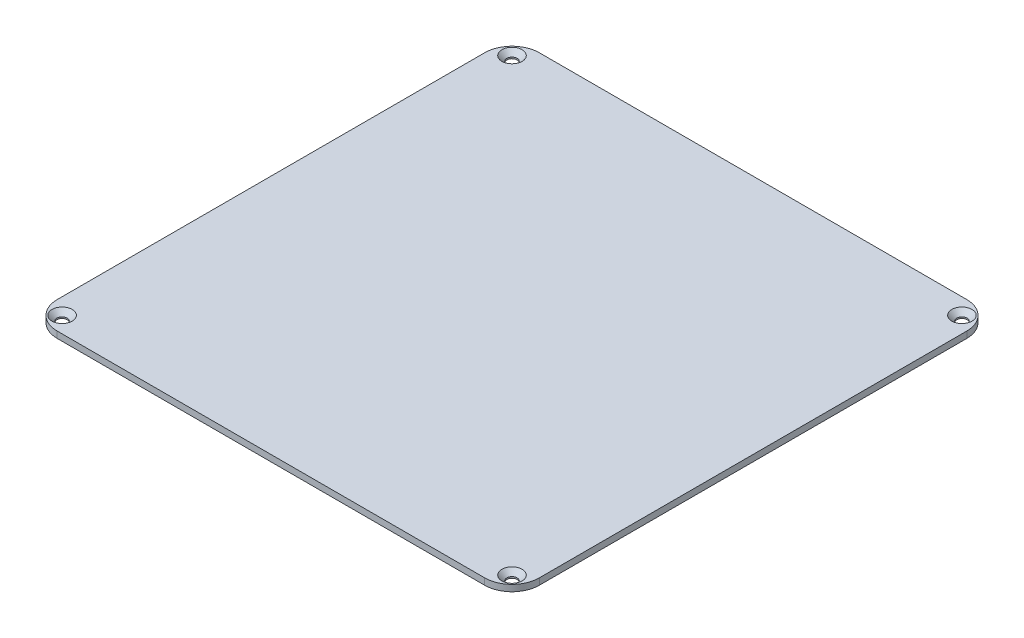
ISO-10303-21;
HEADER;
FILE_DESCRIPTION(('STEP AP214'),'2;1');
FILE_NAME('part.step','',(''),(''),'','','');
FILE_SCHEMA(('AUTOMOTIVE_DESIGN { 1 0 10303 214 1 1 1 1 }'));
ENDSEC;
DATA;
#1=APPLICATION_CONTEXT('core data for automotive mechanical design processes');
#2=APPLICATION_PROTOCOL_DEFINITION('international standard','automotive_design',2000,#1);
#3=PRODUCT_CONTEXT('',#1,'mechanical');
#4=PRODUCT('Part','Part','',(#3));
#5=PRODUCT_RELATED_PRODUCT_CATEGORY('part','',(#4));
#6=PRODUCT_DEFINITION_FORMATION('','',#4);
#7=PRODUCT_DEFINITION_CONTEXT('part definition',#1,'design');
#8=PRODUCT_DEFINITION('design','',#6,#7);
#9=PRODUCT_DEFINITION_SHAPE('','',#8);
#10=(LENGTH_UNIT() NAMED_UNIT(*) SI_UNIT(.MILLI.,.METRE.));
#11=(NAMED_UNIT(*) PLANE_ANGLE_UNIT() SI_UNIT($,.RADIAN.));
#12=(NAMED_UNIT(*) SI_UNIT($,.STERADIAN.) SOLID_ANGLE_UNIT());
#13=UNCERTAINTY_MEASURE_WITH_UNIT(LENGTH_MEASURE(1.E-05),#10,'distance_accuracy_value','');
#14=(GEOMETRIC_REPRESENTATION_CONTEXT(3) GLOBAL_UNCERTAINTY_ASSIGNED_CONTEXT((#13)) GLOBAL_UNIT_ASSIGNED_CONTEXT((#10,
#11,#12)) REPRESENTATION_CONTEXT('',''));
#15=CARTESIAN_POINT('',(0.,0.,0.));
#16=DIRECTION('',(0.,0.,1.));
#17=DIRECTION('',(1.,0.,0.));
#18=AXIS2_PLACEMENT_3D('',#15,#16,#17);
#19=CARTESIAN_POINT('',(0.,4.,0.));
#20=DIRECTION('',(1.,0.,0.));
#21=DIRECTION('',(0.,0.,-1.));
#22=AXIS2_PLACEMENT_3D('',#19,#20,#21);
#23=PLANE('',#22);
#24=DIRECTION('',(0.,0.,1.));
#25=VECTOR('',#24,1.);
#26=CARTESIAN_POINT('',(0.,4.,0.));
#27=LINE('',#26,#25);
#28=CARTESIAN_POINT('',(0.,4.,-283.));
#29=VERTEX_POINT('',#28);
#30=CARTESIAN_POINT('',(0.,4.,-17.));
#31=VERTEX_POINT('',#30);
#32=EDGE_CURVE('E122',#29,#31,#27,.T.);
#33=ORIENTED_EDGE('',*,*,#32,.F.);
#34=DIRECTION('',(0.,-1.,0.));
#35=VECTOR('',#34,1.);
#36=CARTESIAN_POINT('',(0.,4.,-283.));
#37=LINE('',#36,#35);
#38=CARTESIAN_POINT('',(0.,0.,-283.));
#39=VERTEX_POINT('',#38);
#40=EDGE_CURVE('E107',#29,#39,#37,.T.);
#41=ORIENTED_EDGE('',*,*,#40,.T.);
#42=DIRECTION('',(0.,0.,1.));
#43=VECTOR('',#42,1.);
#44=CARTESIAN_POINT('',(0.,0.,0.));
#45=LINE('',#44,#43);
#46=CARTESIAN_POINT('',(0.,0.,-17.));
#47=VERTEX_POINT('',#46);
#48=EDGE_CURVE('E119',#39,#47,#45,.T.);
#49=ORIENTED_EDGE('',*,*,#48,.T.);
#50=DIRECTION('',(0.,-1.,0.));
#51=VECTOR('',#50,1.);
#52=CARTESIAN_POINT('',(0.,4.,-17.));
#53=LINE('',#52,#51);
#54=EDGE_CURVE('E124',#47,#31,#53,.F.);
#55=ORIENTED_EDGE('',*,*,#54,.T.);
#56=EDGE_LOOP('',(#33,#41,#49,#55));
#57=FACE_BOUND('',#56,.T.);
#58=ADVANCED_FACE('F37',(#57),#23,.F.);
#59=CARTESIAN_POINT('',(0.,4.,0.));
#60=DIRECTION('',(0.,0.,-1.));
#61=DIRECTION('',(-1.,0.,0.));
#62=AXIS2_PLACEMENT_3D('',#59,#60,#61);
#63=PLANE('',#62);
#64=DIRECTION('',(1.,0.,0.));
#65=VECTOR('',#64,1.);
#66=CARTESIAN_POINT('',(0.,0.,0.));
#67=LINE('',#66,#65);
#68=CARTESIAN_POINT('',(17.,0.,0.));
#69=VERTEX_POINT('',#68);
#70=CARTESIAN_POINT('',(283.,0.,0.));
#71=VERTEX_POINT('',#70);
#72=EDGE_CURVE('E128',#69,#71,#67,.T.);
#73=ORIENTED_EDGE('',*,*,#72,.T.);
#74=DIRECTION('',(0.,-1.,0.));
#75=VECTOR('',#74,1.);
#76=CARTESIAN_POINT('',(283.,4.,0.));
#77=LINE('',#76,#75);
#78=CARTESIAN_POINT('',(283.,4.,0.));
#79=VERTEX_POINT('',#78);
#80=EDGE_CURVE('E11',#71,#79,#77,.F.);
#81=ORIENTED_EDGE('',*,*,#80,.T.);
#82=DIRECTION('',(1.,0.,0.));
#83=VECTOR('',#82,1.);
#84=CARTESIAN_POINT('',(0.,4.,0.));
#85=LINE('',#84,#83);
#86=CARTESIAN_POINT('',(17.,4.,0.));
#87=VERTEX_POINT('',#86);
#88=EDGE_CURVE('E168',#87,#79,#85,.T.);
#89=ORIENTED_EDGE('',*,*,#88,.F.);
#90=DIRECTION('',(0.,-1.,0.));
#91=VECTOR('',#90,1.);
#92=CARTESIAN_POINT('',(17.,4.,0.));
#93=LINE('',#92,#91);
#94=EDGE_CURVE('E45',#87,#69,#93,.T.);
#95=ORIENTED_EDGE('',*,*,#94,.T.);
#96=EDGE_LOOP('',(#73,#81,#89,#95));
#97=FACE_BOUND('',#96,.T.);
#98=ADVANCED_FACE('F166',(#97),#63,.F.);
#99=CARTESIAN_POINT('',(300.,4.,0.));
#100=DIRECTION('',(-1.,0.,0.));
#101=DIRECTION('',(0.,0.,1.));
#102=AXIS2_PLACEMENT_3D('',#99,#100,#101);
#103=PLANE('',#102);
#104=DIRECTION('',(0.,0.,-1.));
#105=VECTOR('',#104,1.);
#106=CARTESIAN_POINT('',(300.,0.,0.));
#107=LINE('',#106,#105);
#108=CARTESIAN_POINT('',(300.,0.,-17.));
#109=VERTEX_POINT('',#108);
#110=CARTESIAN_POINT('',(300.,0.,-283.));
#111=VERTEX_POINT('',#110);
#112=EDGE_CURVE('E132',#109,#111,#107,.T.);
#113=ORIENTED_EDGE('',*,*,#112,.T.);
#114=DIRECTION('',(0.,-1.,0.));
#115=VECTOR('',#114,1.);
#116=CARTESIAN_POINT('',(300.,4.,-283.));
#117=LINE('',#116,#115);
#118=CARTESIAN_POINT('',(300.,4.,-283.));
#119=VERTEX_POINT('',#118);
#120=EDGE_CURVE('E52',#111,#119,#117,.F.);
#121=ORIENTED_EDGE('',*,*,#120,.T.);
#122=DIRECTION('',(0.,0.,-1.));
#123=VECTOR('',#122,1.);
#124=CARTESIAN_POINT('',(300.,4.,0.));
#125=LINE('',#124,#123);
#126=CARTESIAN_POINT('',(300.,4.,-17.));
#127=VERTEX_POINT('',#126);
#128=EDGE_CURVE('E176',#127,#119,#125,.T.);
#129=ORIENTED_EDGE('',*,*,#128,.F.);
#130=DIRECTION('',(0.,-1.,0.));
#131=VECTOR('',#130,1.);
#132=CARTESIAN_POINT('',(300.,4.,-17.));
#133=LINE('',#132,#131);
#134=EDGE_CURVE('E159',#127,#109,#133,.T.);
#135=ORIENTED_EDGE('',*,*,#134,.T.);
#136=EDGE_LOOP('',(#113,#121,#129,#135));
#137=FACE_BOUND('',#136,.T.);
#138=ADVANCED_FACE('F175',(#137),#103,.F.);
#139=CARTESIAN_POINT('',(0.,4.,-300.));
#140=DIRECTION('',(0.,0.,1.));
#141=DIRECTION('',(1.,0.,0.));
#142=AXIS2_PLACEMENT_3D('',#139,#140,#141);
#143=PLANE('',#142);
#144=DIRECTION('',(-1.,0.,0.));
#145=VECTOR('',#144,1.);
#146=CARTESIAN_POINT('',(0.,0.,-300.));
#147=LINE('',#146,#145);
#148=CARTESIAN_POINT('',(283.,0.,-300.));
#149=VERTEX_POINT('',#148);
#150=CARTESIAN_POINT('',(17.,0.,-300.));
#151=VERTEX_POINT('',#150);
#152=EDGE_CURVE('E142',#149,#151,#147,.T.);
#153=ORIENTED_EDGE('',*,*,#152,.T.);
#154=DIRECTION('',(0.,-1.,0.));
#155=VECTOR('',#154,1.);
#156=CARTESIAN_POINT('',(17.,4.,-300.));
#157=LINE('',#156,#155);
#158=CARTESIAN_POINT('',(17.,4.,-300.));
#159=VERTEX_POINT('',#158);
#160=EDGE_CURVE('E108',#151,#159,#157,.F.);
#161=ORIENTED_EDGE('',*,*,#160,.T.);
#162=DIRECTION('',(-1.,0.,0.));
#163=VECTOR('',#162,1.);
#164=CARTESIAN_POINT('',(0.,4.,-300.));
#165=LINE('',#164,#163);
#166=CARTESIAN_POINT('',(283.,4.,-300.));
#167=VERTEX_POINT('',#166);
#168=EDGE_CURVE('E138',#167,#159,#165,.T.);
#169=ORIENTED_EDGE('',*,*,#168,.F.);
#170=DIRECTION('',(0.,-1.,0.));
#171=VECTOR('',#170,1.);
#172=CARTESIAN_POINT('',(283.,4.,-300.));
#173=LINE('',#172,#171);
#174=EDGE_CURVE('E113',#167,#149,#173,.T.);
#175=ORIENTED_EDGE('',*,*,#174,.T.);
#176=EDGE_LOOP('',(#153,#161,#169,#175));
#177=FACE_BOUND('',#176,.T.);
#178=ADVANCED_FACE('F220',(#177),#143,.F.);
#179=CARTESIAN_POINT('',(0.,4.,0.));
#180=DIRECTION('',(0.,-1.,0.));
#181=DIRECTION('',(0.,0.,-1.));
#182=AXIS2_PLACEMENT_3D('',#179,#180,#181);
#183=PLANE('',#182);
#184=CARTESIAN_POINT('',(290.,4.,-10.));
#185=DIRECTION('',(0.,1.,0.));
#186=DIRECTION('',(0.,0.,1.));
#187=AXIS2_PLACEMENT_3D('',#184,#185,#186);
#188=CIRCLE('',#187,6.29999999999997);
#189=CARTESIAN_POINT('',(290.,4.,-3.70000000000003));
#190=VERTEX_POINT('',#189);
#191=EDGE_CURVE('E211',#190,#190,#188,.T.);
#192=ORIENTED_EDGE('',*,*,#191,.F.);
#193=EDGE_LOOP('',(#192));
#194=FACE_BOUND('',#193,.T.);
#195=CARTESIAN_POINT('',(10.,4.,-10.));
#196=DIRECTION('',(0.,1.,0.));
#197=DIRECTION('',(0.,0.,1.));
#198=AXIS2_PLACEMENT_3D('',#195,#196,#197);
#199=CIRCLE('',#198,6.3);
#200=CARTESIAN_POINT('',(10.,4.,-3.7));
#201=VERTEX_POINT('',#200);
#202=EDGE_CURVE('E202',#201,#201,#199,.T.);
#203=ORIENTED_EDGE('',*,*,#202,.F.);
#204=EDGE_LOOP('',(#203));
#205=FACE_BOUND('',#204,.T.);
#206=CARTESIAN_POINT('',(10.,4.,-290.));
#207=DIRECTION('',(0.,1.,0.));
#208=DIRECTION('',(0.,0.,1.));
#209=AXIS2_PLACEMENT_3D('',#206,#207,#208);
#210=CIRCLE('',#209,6.3);
#211=CARTESIAN_POINT('',(10.,4.,-283.7));
#212=VERTEX_POINT('',#211);
#213=EDGE_CURVE('E193',#212,#212,#210,.T.);
#214=ORIENTED_EDGE('',*,*,#213,.F.);
#215=EDGE_LOOP('',(#214));
#216=FACE_BOUND('',#215,.T.);
#217=CARTESIAN_POINT('',(290.,4.,-290.));
#218=DIRECTION('',(0.,1.,0.));
#219=DIRECTION('',(0.,0.,1.));
#220=AXIS2_PLACEMENT_3D('',#217,#218,#219);
#221=CIRCLE('',#220,6.29999999999997);
#222=CARTESIAN_POINT('',(290.,4.,-283.7));
#223=VERTEX_POINT('',#222);
#224=EDGE_CURVE('E184',#223,#223,#221,.T.);
#225=ORIENTED_EDGE('',*,*,#224,.F.);
#226=EDGE_LOOP('',(#225));
#227=FACE_BOUND('',#226,.T.);
#228=ORIENTED_EDGE('',*,*,#168,.T.);
#229=CARTESIAN_POINT('',(17.,4.,-283.));
#230=DIRECTION('',(0.,-1.,0.));
#231=DIRECTION('',(0.,0.,-1.));
#232=AXIS2_PLACEMENT_3D('',#229,#230,#231);
#233=CIRCLE('',#232,17.);
#234=EDGE_CURVE('E157',#159,#29,#233,.F.);
#235=ORIENTED_EDGE('',*,*,#234,.T.);
#236=ORIENTED_EDGE('',*,*,#32,.T.);
#237=CARTESIAN_POINT('',(17.,4.,-17.));
#238=DIRECTION('',(0.,-1.,0.));
#239=DIRECTION('',(0.,0.,-1.));
#240=AXIS2_PLACEMENT_3D('',#237,#238,#239);
#241=CIRCLE('',#240,17.);
#242=EDGE_CURVE('E152',#31,#87,#241,.F.);
#243=ORIENTED_EDGE('',*,*,#242,.T.);
#244=ORIENTED_EDGE('',*,*,#88,.T.);
#245=CARTESIAN_POINT('',(283.,4.,-17.));
#246=DIRECTION('',(0.,-1.,0.));
#247=DIRECTION('',(0.,0.,-1.));
#248=AXIS2_PLACEMENT_3D('',#245,#246,#247);
#249=CIRCLE('',#248,17.);
#250=EDGE_CURVE('E59',#79,#127,#249,.F.);
#251=ORIENTED_EDGE('',*,*,#250,.T.);
#252=ORIENTED_EDGE('',*,*,#128,.T.);
#253=CARTESIAN_POINT('',(283.,4.,-283.));
#254=DIRECTION('',(0.,-1.,0.));
#255=DIRECTION('',(0.,0.,-1.));
#256=AXIS2_PLACEMENT_3D('',#253,#254,#255);
#257=CIRCLE('',#256,17.);
#258=EDGE_CURVE('E155',#119,#167,#257,.F.);
#259=ORIENTED_EDGE('',*,*,#258,.T.);
#260=EDGE_LOOP('',(#228,#235,#236,#243,#244,#251,#252,#259));
#261=FACE_BOUND('',#260,.T.);
#262=ADVANCED_FACE('F217',(#194,#205,#216,#227,#261),#183,.F.);
#263=CARTESIAN_POINT('',(0.,0.,0.));
#264=DIRECTION('',(0.,-1.,0.));
#265=DIRECTION('',(0.,0.,-1.));
#266=AXIS2_PLACEMENT_3D('',#263,#264,#265);
#267=PLANE('',#266);
#268=CARTESIAN_POINT('',(290.,0.,-10.));
#269=DIRECTION('',(0.,1.,0.));
#270=DIRECTION('',(0.,0.,1.));
#271=AXIS2_PLACEMENT_3D('',#268,#269,#270);
#272=CIRCLE('',#271,3.19999999999998);
#273=CARTESIAN_POINT('',(290.,0.,-6.80000000000002));
#274=VERTEX_POINT('',#273);
#275=EDGE_CURVE('E205',#274,#274,#272,.T.);
#276=ORIENTED_EDGE('',*,*,#275,.T.);
#277=EDGE_LOOP('',(#276));
#278=FACE_BOUND('',#277,.T.);
#279=CARTESIAN_POINT('',(10.,0.,-10.));
#280=DIRECTION('',(0.,1.,0.));
#281=DIRECTION('',(0.,0.,1.));
#282=AXIS2_PLACEMENT_3D('',#279,#280,#281);
#283=CIRCLE('',#282,3.2);
#284=CARTESIAN_POINT('',(10.,0.,-6.8));
#285=VERTEX_POINT('',#284);
#286=EDGE_CURVE('E196',#285,#285,#283,.T.);
#287=ORIENTED_EDGE('',*,*,#286,.T.);
#288=EDGE_LOOP('',(#287));
#289=FACE_BOUND('',#288,.T.);
#290=CARTESIAN_POINT('',(10.,0.,-290.));
#291=DIRECTION('',(0.,1.,0.));
#292=DIRECTION('',(0.,0.,1.));
#293=AXIS2_PLACEMENT_3D('',#290,#291,#292);
#294=CIRCLE('',#293,3.2);
#295=CARTESIAN_POINT('',(10.,0.,-286.8));
#296=VERTEX_POINT('',#295);
#297=EDGE_CURVE('E187',#296,#296,#294,.T.);
#298=ORIENTED_EDGE('',*,*,#297,.T.);
#299=EDGE_LOOP('',(#298));
#300=FACE_BOUND('',#299,.T.);
#301=CARTESIAN_POINT('',(290.,0.,-290.));
#302=DIRECTION('',(0.,1.,0.));
#303=DIRECTION('',(0.,0.,1.));
#304=AXIS2_PLACEMENT_3D('',#301,#302,#303);
#305=CIRCLE('',#304,3.19999999999998);
#306=CARTESIAN_POINT('',(290.,0.,-286.8));
#307=VERTEX_POINT('',#306);
#308=EDGE_CURVE('E129',#307,#307,#305,.T.);
#309=ORIENTED_EDGE('',*,*,#308,.T.);
#310=EDGE_LOOP('',(#309));
#311=FACE_BOUND('',#310,.T.);
#312=ORIENTED_EDGE('',*,*,#48,.F.);
#313=CARTESIAN_POINT('',(17.,0.,-283.));
#314=DIRECTION('',(0.,-1.,0.));
#315=DIRECTION('',(0.,0.,-1.));
#316=AXIS2_PLACEMENT_3D('',#313,#314,#315);
#317=CIRCLE('',#316,17.);
#318=EDGE_CURVE('E103',#39,#151,#317,.T.);
#319=ORIENTED_EDGE('',*,*,#318,.T.);
#320=ORIENTED_EDGE('',*,*,#152,.F.);
#321=CARTESIAN_POINT('',(283.,0.,-283.));
#322=DIRECTION('',(0.,-1.,0.));
#323=DIRECTION('',(0.,0.,-1.));
#324=AXIS2_PLACEMENT_3D('',#321,#322,#323);
#325=CIRCLE('',#324,17.);
#326=EDGE_CURVE('E114',#149,#111,#325,.T.);
#327=ORIENTED_EDGE('',*,*,#326,.T.);
#328=ORIENTED_EDGE('',*,*,#112,.F.);
#329=CARTESIAN_POINT('',(283.,0.,-17.));
#330=DIRECTION('',(0.,-1.,0.));
#331=DIRECTION('',(0.,0.,-1.));
#332=AXIS2_PLACEMENT_3D('',#329,#330,#331);
#333=CIRCLE('',#332,17.);
#334=EDGE_CURVE('E146',#109,#71,#333,.T.);
#335=ORIENTED_EDGE('',*,*,#334,.T.);
#336=ORIENTED_EDGE('',*,*,#72,.F.);
#337=CARTESIAN_POINT('',(17.,0.,-17.));
#338=DIRECTION('',(0.,-1.,0.));
#339=DIRECTION('',(0.,0.,-1.));
#340=AXIS2_PLACEMENT_3D('',#337,#338,#339);
#341=CIRCLE('',#340,17.);
#342=EDGE_CURVE('E123',#69,#47,#341,.T.);
#343=ORIENTED_EDGE('',*,*,#342,.T.);
#344=EDGE_LOOP('',(#312,#319,#320,#327,#328,#335,#336,#343));
#345=FACE_BOUND('',#344,.T.);
#346=ADVANCED_FACE('F126',(#278,#289,#300,#311,#345),#267,.T.);
#347=CARTESIAN_POINT('',(17.,4.,-283.));
#348=DIRECTION('',(0.,-1.,0.));
#349=DIRECTION('',(0.,0.,-1.));
#350=AXIS2_PLACEMENT_3D('',#347,#348,#349);
#351=CYLINDRICAL_SURFACE('',#350,17.);
#352=ORIENTED_EDGE('',*,*,#234,.F.);
#353=ORIENTED_EDGE('',*,*,#160,.F.);
#354=ORIENTED_EDGE('',*,*,#318,.F.);
#355=ORIENTED_EDGE('',*,*,#40,.F.);
#356=EDGE_LOOP('',(#352,#353,#354,#355));
#357=FACE_BOUND('',#356,.T.);
#358=ADVANCED_FACE('F106',(#357),#351,.T.);
#359=CARTESIAN_POINT('',(283.,4.,-283.));
#360=DIRECTION('',(0.,-1.,0.));
#361=DIRECTION('',(0.,0.,-1.));
#362=AXIS2_PLACEMENT_3D('',#359,#360,#361);
#363=CYLINDRICAL_SURFACE('',#362,17.);
#364=ORIENTED_EDGE('',*,*,#258,.F.);
#365=ORIENTED_EDGE('',*,*,#120,.F.);
#366=ORIENTED_EDGE('',*,*,#326,.F.);
#367=ORIENTED_EDGE('',*,*,#174,.F.);
#368=EDGE_LOOP('',(#364,#365,#366,#367));
#369=FACE_BOUND('',#368,.T.);
#370=ADVANCED_FACE('F231',(#369),#363,.T.);
#371=CARTESIAN_POINT('',(283.,4.,-17.));
#372=DIRECTION('',(0.,-1.,0.));
#373=DIRECTION('',(0.,0.,-1.));
#374=AXIS2_PLACEMENT_3D('',#371,#372,#373);
#375=CYLINDRICAL_SURFACE('',#374,17.);
#376=ORIENTED_EDGE('',*,*,#250,.F.);
#377=ORIENTED_EDGE('',*,*,#80,.F.);
#378=ORIENTED_EDGE('',*,*,#334,.F.);
#379=ORIENTED_EDGE('',*,*,#134,.F.);
#380=EDGE_LOOP('',(#376,#377,#378,#379));
#381=FACE_BOUND('',#380,.T.);
#382=ADVANCED_FACE('F174',(#381),#375,.T.);
#383=CARTESIAN_POINT('',(17.,4.,-17.));
#384=DIRECTION('',(0.,-1.,0.));
#385=DIRECTION('',(0.,0.,-1.));
#386=AXIS2_PLACEMENT_3D('',#383,#384,#385);
#387=CYLINDRICAL_SURFACE('',#386,17.);
#388=ORIENTED_EDGE('',*,*,#242,.F.);
#389=ORIENTED_EDGE('',*,*,#54,.F.);
#390=ORIENTED_EDGE('',*,*,#342,.F.);
#391=ORIENTED_EDGE('',*,*,#94,.F.);
#392=EDGE_LOOP('',(#388,#389,#390,#391));
#393=FACE_BOUND('',#392,.T.);
#394=ADVANCED_FACE('F39',(#393),#387,.T.);
#395=CARTESIAN_POINT('',(290.,4.,-290.));
#396=DIRECTION('',(0.,1.,0.));
#397=DIRECTION('',(0.,0.,1.));
#398=AXIS2_PLACEMENT_3D('',#395,#396,#397);
#399=CYLINDRICAL_SURFACE('',#398,3.19999999999998);
#400=ORIENTED_EDGE('',*,*,#308,.F.);
#401=EDGE_LOOP('',(#400));
#402=FACE_BOUND('',#401,.T.);
#403=CARTESIAN_POINT('',(290.,0.899999999999998,-290.));
#404=DIRECTION('',(0.,1.,0.));
#405=DIRECTION('',(0.,0.,1.));
#406=AXIS2_PLACEMENT_3D('',#403,#404,#405);
#407=CIRCLE('',#406,3.19999999999998);
#408=CARTESIAN_POINT('',(290.,0.899999999999998,-286.8));
#409=VERTEX_POINT('',#408);
#410=EDGE_CURVE('E135',#409,#409,#407,.T.);
#411=ORIENTED_EDGE('',*,*,#410,.T.);
#412=EDGE_LOOP('',(#411));
#413=FACE_BOUND('',#412,.T.);
#414=ADVANCED_FACE('F253',(#402,#413),#399,.F.);
#415=CARTESIAN_POINT('',(290.,4.,-290.));
#416=DIRECTION('',(0.,1.,0.));
#417=DIRECTION('',(0.,0.,1.));
#418=AXIS2_PLACEMENT_3D('',#415,#416,#417);
#419=CONICAL_SURFACE('',#418,6.29999999999997,0.785398163397447);
#420=ORIENTED_EDGE('',*,*,#410,.F.);
#421=EDGE_LOOP('',(#420));
#422=FACE_BOUND('',#421,.T.);
#423=ORIENTED_EDGE('',*,*,#224,.T.);
#424=EDGE_LOOP('',(#423));
#425=FACE_BOUND('',#424,.T.);
#426=ADVANCED_FACE('F256',(#422,#425),#419,.F.);
#427=CARTESIAN_POINT('',(10.,4.,-290.));
#428=DIRECTION('',(0.,1.,0.));
#429=DIRECTION('',(0.,0.,1.));
#430=AXIS2_PLACEMENT_3D('',#427,#428,#429);
#431=CYLINDRICAL_SURFACE('',#430,3.2);
#432=ORIENTED_EDGE('',*,*,#297,.F.);
#433=EDGE_LOOP('',(#432));
#434=FACE_BOUND('',#433,.T.);
#435=CARTESIAN_POINT('',(10.,0.899999999999998,-290.));
#436=DIRECTION('',(0.,1.,0.));
#437=DIRECTION('',(0.,0.,1.));
#438=AXIS2_PLACEMENT_3D('',#435,#436,#437);
#439=CIRCLE('',#438,3.2);
#440=CARTESIAN_POINT('',(10.,0.899999999999998,-286.8));
#441=VERTEX_POINT('',#440);
#442=EDGE_CURVE('E190',#441,#441,#439,.T.);
#443=ORIENTED_EDGE('',*,*,#442,.T.);
#444=EDGE_LOOP('',(#443));
#445=FACE_BOUND('',#444,.T.);
#446=ADVANCED_FACE('F260',(#434,#445),#431,.F.);
#447=CARTESIAN_POINT('',(10.,4.,-290.));
#448=DIRECTION('',(0.,1.,0.));
#449=DIRECTION('',(0.,0.,1.));
#450=AXIS2_PLACEMENT_3D('',#447,#448,#449);
#451=CONICAL_SURFACE('',#450,6.3,0.785398163397448);
#452=ORIENTED_EDGE('',*,*,#442,.F.);
#453=EDGE_LOOP('',(#452));
#454=FACE_BOUND('',#453,.T.);
#455=ORIENTED_EDGE('',*,*,#213,.T.);
#456=EDGE_LOOP('',(#455));
#457=FACE_BOUND('',#456,.T.);
#458=ADVANCED_FACE('F264',(#454,#457),#451,.F.);
#459=CARTESIAN_POINT('',(10.,4.,-10.));
#460=DIRECTION('',(0.,1.,0.));
#461=DIRECTION('',(0.,0.,1.));
#462=AXIS2_PLACEMENT_3D('',#459,#460,#461);
#463=CYLINDRICAL_SURFACE('',#462,3.2);
#464=ORIENTED_EDGE('',*,*,#286,.F.);
#465=EDGE_LOOP('',(#464));
#466=FACE_BOUND('',#465,.T.);
#467=CARTESIAN_POINT('',(10.,0.899999999999998,-10.));
#468=DIRECTION('',(0.,1.,0.));
#469=DIRECTION('',(0.,0.,1.));
#470=AXIS2_PLACEMENT_3D('',#467,#468,#469);
#471=CIRCLE('',#470,3.2);
#472=CARTESIAN_POINT('',(10.,0.899999999999998,-6.8));
#473=VERTEX_POINT('',#472);
#474=EDGE_CURVE('E199',#473,#473,#471,.T.);
#475=ORIENTED_EDGE('',*,*,#474,.T.);
#476=EDGE_LOOP('',(#475));
#477=FACE_BOUND('',#476,.T.);
#478=ADVANCED_FACE('F268',(#466,#477),#463,.F.);
#479=CARTESIAN_POINT('',(10.,4.,-10.));
#480=DIRECTION('',(0.,1.,0.));
#481=DIRECTION('',(0.,0.,1.));
#482=AXIS2_PLACEMENT_3D('',#479,#480,#481);
#483=CONICAL_SURFACE('',#482,6.3,0.785398163397449);
#484=ORIENTED_EDGE('',*,*,#474,.F.);
#485=EDGE_LOOP('',(#484));
#486=FACE_BOUND('',#485,.T.);
#487=ORIENTED_EDGE('',*,*,#202,.T.);
#488=EDGE_LOOP('',(#487));
#489=FACE_BOUND('',#488,.T.);
#490=ADVANCED_FACE('F272',(#486,#489),#483,.F.);
#491=CARTESIAN_POINT('',(290.,4.,-10.));
#492=DIRECTION('',(0.,1.,0.));
#493=DIRECTION('',(0.,0.,1.));
#494=AXIS2_PLACEMENT_3D('',#491,#492,#493);
#495=CYLINDRICAL_SURFACE('',#494,3.19999999999998);
#496=ORIENTED_EDGE('',*,*,#275,.F.);
#497=EDGE_LOOP('',(#496));
#498=FACE_BOUND('',#497,.T.);
#499=CARTESIAN_POINT('',(290.,0.899999999999998,-10.));
#500=DIRECTION('',(0.,1.,0.));
#501=DIRECTION('',(0.,0.,1.));
#502=AXIS2_PLACEMENT_3D('',#499,#500,#501);
#503=CIRCLE('',#502,3.19999999999998);
#504=CARTESIAN_POINT('',(290.,0.899999999999998,-6.80000000000002));
#505=VERTEX_POINT('',#504);
#506=EDGE_CURVE('E208',#505,#505,#503,.T.);
#507=ORIENTED_EDGE('',*,*,#506,.T.);
#508=EDGE_LOOP('',(#507));
#509=FACE_BOUND('',#508,.T.);
#510=ADVANCED_FACE('F276',(#498,#509),#495,.F.);
#511=CARTESIAN_POINT('',(290.,4.,-10.));
#512=DIRECTION('',(0.,1.,0.));
#513=DIRECTION('',(0.,0.,1.));
#514=AXIS2_PLACEMENT_3D('',#511,#512,#513);
#515=CONICAL_SURFACE('',#514,6.29999999999997,0.785398163397447);
#516=ORIENTED_EDGE('',*,*,#506,.F.);
#517=EDGE_LOOP('',(#516));
#518=FACE_BOUND('',#517,.T.);
#519=ORIENTED_EDGE('',*,*,#191,.T.);
#520=EDGE_LOOP('',(#519));
#521=FACE_BOUND('',#520,.T.);
#522=ADVANCED_FACE('F215',(#518,#521),#515,.F.);
#523=CLOSED_SHELL('',(#58,#98,#138,#178,#262,#346,#358,#370,#382,#394,#414,#426,#446,#458,#478,
#490,#510,#522));
#524=MANIFOLD_SOLID_BREP('B2',#523);
#525=ADVANCED_BREP_SHAPE_REPRESENTATION('',(#18,#524),#14);
#526=SHAPE_DEFINITION_REPRESENTATION(#9,#525);
ENDSEC;
END-ISO-10303-21;
